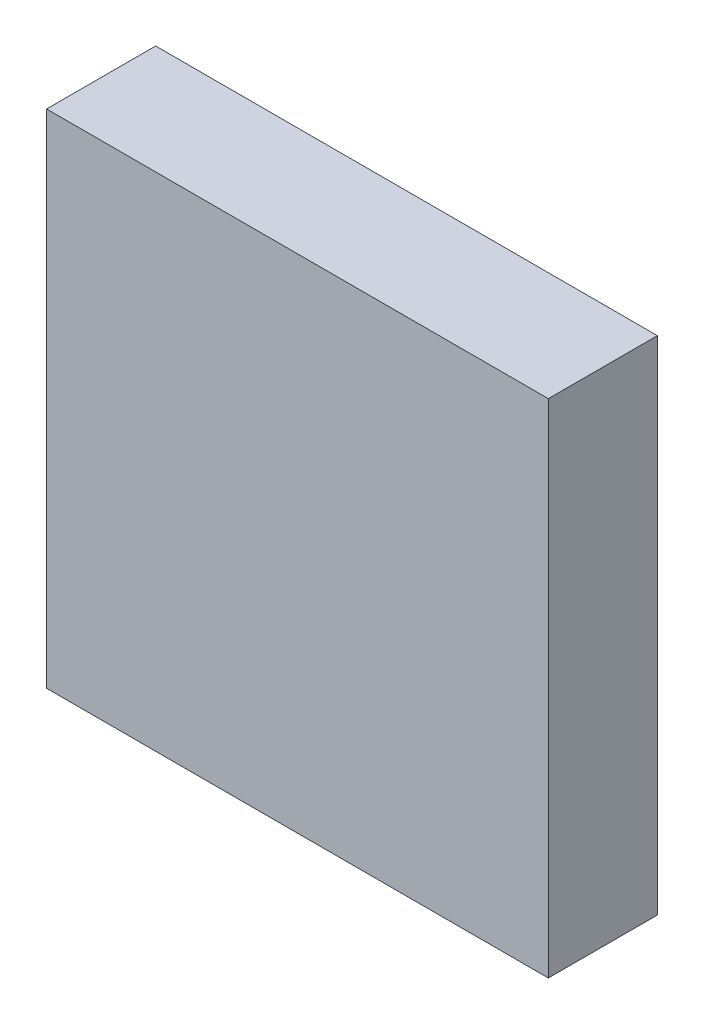
ISO-10303-21;
HEADER;
FILE_DESCRIPTION(('STEP AP214'),'2;1');
FILE_NAME('part.step','',(''),(''),'','','');
FILE_SCHEMA(('AUTOMOTIVE_DESIGN { 1 0 10303 214 1 1 1 1 }'));
ENDSEC;
DATA;
#1=APPLICATION_CONTEXT('core data for automotive mechanical design processes');
#2=APPLICATION_PROTOCOL_DEFINITION('international standard','automotive_design',2000,#1);
#3=PRODUCT_CONTEXT('',#1,'mechanical');
#4=PRODUCT('Part','Part','',(#3));
#5=PRODUCT_RELATED_PRODUCT_CATEGORY('part','',(#4));
#6=PRODUCT_DEFINITION_FORMATION('','',#4);
#7=PRODUCT_DEFINITION_CONTEXT('part definition',#1,'design');
#8=PRODUCT_DEFINITION('design','',#6,#7);
#9=PRODUCT_DEFINITION_SHAPE('','',#8);
#10=(LENGTH_UNIT() NAMED_UNIT(*) SI_UNIT(.MILLI.,.METRE.));
#11=(NAMED_UNIT(*) PLANE_ANGLE_UNIT() SI_UNIT($,.RADIAN.));
#12=(NAMED_UNIT(*) SI_UNIT($,.STERADIAN.) SOLID_ANGLE_UNIT());
#13=UNCERTAINTY_MEASURE_WITH_UNIT(LENGTH_MEASURE(1.E-05),#10,'distance_accuracy_value','');
#14=(GEOMETRIC_REPRESENTATION_CONTEXT(3) GLOBAL_UNCERTAINTY_ASSIGNED_CONTEXT((#13)) GLOBAL_UNIT_ASSIGNED_CONTEXT((#10,
#11,#12)) REPRESENTATION_CONTEXT('',''));
#15=CARTESIAN_POINT('',(0.,0.,0.));
#16=DIRECTION('',(0.,0.,1.));
#17=DIRECTION('',(1.,0.,0.));
#18=AXIS2_PLACEMENT_3D('',#15,#16,#17);
#19=CARTESIAN_POINT('',(0.,0.,5.));
#20=DIRECTION('',(1.,0.,0.));
#21=DIRECTION('',(0.,1.,0.));
#22=AXIS2_PLACEMENT_3D('',#19,#20,#21);
#23=PLANE('',#22);
#24=DIRECTION('',(0.,-1.,0.));
#25=VECTOR('',#24,1.);
#26=CARTESIAN_POINT('',(0.,0.,0.));
#27=LINE('',#26,#25);
#28=CARTESIAN_POINT('',(0.,0.,0.));
#29=VERTEX_POINT('',#28);
#30=CARTESIAN_POINT('',(0.,-23.,0.));
#31=VERTEX_POINT('',#30);
#32=EDGE_CURVE('E96',#29,#31,#27,.T.);
#33=ORIENTED_EDGE('',*,*,#32,.T.);
#34=DIRECTION('',(0.,0.,-1.));
#35=VECTOR('',#34,1.);
#36=CARTESIAN_POINT('',(0.,-23.,5.));
#37=LINE('',#36,#35);
#38=CARTESIAN_POINT('',(0.,-23.,5.));
#39=VERTEX_POINT('',#38);
#40=EDGE_CURVE('E11',#39,#31,#37,.T.);
#41=ORIENTED_EDGE('',*,*,#40,.F.);
#42=DIRECTION('',(0.,-1.,0.));
#43=VECTOR('',#42,1.);
#44=CARTESIAN_POINT('',(0.,0.,5.));
#45=LINE('',#44,#43);
#46=CARTESIAN_POINT('',(0.,0.,5.));
#47=VERTEX_POINT('',#46);
#48=EDGE_CURVE('E84',#47,#39,#45,.T.);
#49=ORIENTED_EDGE('',*,*,#48,.F.);
#50=DIRECTION('',(0.,0.,-1.));
#51=VECTOR('',#50,1.);
#52=CARTESIAN_POINT('',(0.,0.,5.));
#53=LINE('',#52,#51);
#54=EDGE_CURVE('E92',#47,#29,#53,.T.);
#55=ORIENTED_EDGE('',*,*,#54,.T.);
#56=EDGE_LOOP('',(#33,#41,#49,#55));
#57=FACE_BOUND('',#56,.T.);
#58=ADVANCED_FACE('F33',(#57),#23,.F.);
#59=CARTESIAN_POINT('',(0.,-23.,5.));
#60=DIRECTION('',(0.,1.,0.));
#61=DIRECTION('',(0.,0.,1.));
#62=AXIS2_PLACEMENT_3D('',#59,#60,#61);
#63=PLANE('',#62);
#64=DIRECTION('',(1.,0.,0.));
#65=VECTOR('',#64,1.);
#66=CARTESIAN_POINT('',(0.,-23.,0.));
#67=LINE('',#66,#65);
#68=CARTESIAN_POINT('',(23.,-23.,0.));
#69=VERTEX_POINT('',#68);
#70=EDGE_CURVE('E88',#31,#69,#67,.T.);
#71=ORIENTED_EDGE('',*,*,#70,.T.);
#72=DIRECTION('',(0.,0.,-1.));
#73=VECTOR('',#72,1.);
#74=CARTESIAN_POINT('',(23.,-23.,5.));
#75=LINE('',#74,#73);
#76=CARTESIAN_POINT('',(23.,-23.,5.));
#77=VERTEX_POINT('',#76);
#78=EDGE_CURVE('E41',#77,#69,#75,.T.);
#79=ORIENTED_EDGE('',*,*,#78,.F.);
#80=DIRECTION('',(1.,0.,0.));
#81=VECTOR('',#80,1.);
#82=CARTESIAN_POINT('',(0.,-23.,5.));
#83=LINE('',#82,#81);
#84=EDGE_CURVE('E79',#39,#77,#83,.T.);
#85=ORIENTED_EDGE('',*,*,#84,.F.);
#86=ORIENTED_EDGE('',*,*,#40,.T.);
#87=EDGE_LOOP('',(#71,#79,#85,#86));
#88=FACE_BOUND('',#87,.T.);
#89=ADVANCED_FACE('F87',(#88),#63,.F.);
#90=CARTESIAN_POINT('',(23.,0.,5.));
#91=DIRECTION('',(-1.,0.,0.));
#92=DIRECTION('',(0.,-1.,0.));
#93=AXIS2_PLACEMENT_3D('',#90,#91,#92);
#94=PLANE('',#93);
#95=DIRECTION('',(0.,1.,0.));
#96=VECTOR('',#95,1.);
#97=CARTESIAN_POINT('',(23.,0.,0.));
#98=LINE('',#97,#96);
#99=CARTESIAN_POINT('',(23.,0.,0.));
#100=VERTEX_POINT('',#99);
#101=EDGE_CURVE('E66',#69,#100,#98,.T.);
#102=ORIENTED_EDGE('',*,*,#101,.T.);
#103=DIRECTION('',(0.,0.,-1.));
#104=VECTOR('',#103,1.);
#105=CARTESIAN_POINT('',(23.,0.,5.));
#106=LINE('',#105,#104);
#107=CARTESIAN_POINT('',(23.,0.,5.));
#108=VERTEX_POINT('',#107);
#109=EDGE_CURVE('E89',#108,#100,#106,.T.);
#110=ORIENTED_EDGE('',*,*,#109,.F.);
#111=DIRECTION('',(0.,1.,0.));
#112=VECTOR('',#111,1.);
#113=CARTESIAN_POINT('',(23.,0.,5.));
#114=LINE('',#113,#112);
#115=EDGE_CURVE('E82',#77,#108,#114,.T.);
#116=ORIENTED_EDGE('',*,*,#115,.F.);
#117=ORIENTED_EDGE('',*,*,#78,.T.);
#118=EDGE_LOOP('',(#102,#110,#116,#117));
#119=FACE_BOUND('',#118,.T.);
#120=ADVANCED_FACE('F90',(#119),#94,.F.);
#121=CARTESIAN_POINT('',(0.,0.,5.));
#122=DIRECTION('',(0.,-1.,0.));
#123=DIRECTION('',(0.,0.,-1.));
#124=AXIS2_PLACEMENT_3D('',#121,#122,#123);
#125=PLANE('',#124);
#126=DIRECTION('',(-1.,0.,0.));
#127=VECTOR('',#126,1.);
#128=CARTESIAN_POINT('',(0.,0.,0.));
#129=LINE('',#128,#127);
#130=EDGE_CURVE('E72',#100,#29,#129,.T.);
#131=ORIENTED_EDGE('',*,*,#130,.T.);
#132=ORIENTED_EDGE('',*,*,#54,.F.);
#133=DIRECTION('',(-1.,0.,0.));
#134=VECTOR('',#133,1.);
#135=CARTESIAN_POINT('',(0.,0.,5.));
#136=LINE('',#135,#134);
#137=EDGE_CURVE('E49',#108,#47,#136,.T.);
#138=ORIENTED_EDGE('',*,*,#137,.F.);
#139=ORIENTED_EDGE('',*,*,#109,.T.);
#140=EDGE_LOOP('',(#131,#132,#138,#139));
#141=FACE_BOUND('',#140,.T.);
#142=ADVANCED_FACE('F103',(#141),#125,.F.);
#143=CARTESIAN_POINT('',(0.,0.,5.));
#144=DIRECTION('',(0.,0.,1.));
#145=DIRECTION('',(1.,0.,0.));
#146=AXIS2_PLACEMENT_3D('',#143,#144,#145);
#147=PLANE('',#146);
#148=ORIENTED_EDGE('',*,*,#48,.T.);
#149=ORIENTED_EDGE('',*,*,#84,.T.);
#150=ORIENTED_EDGE('',*,*,#115,.T.);
#151=ORIENTED_EDGE('',*,*,#137,.T.);
#152=EDGE_LOOP('',(#148,#149,#150,#151));
#153=FACE_BOUND('',#152,.T.);
#154=ADVANCED_FACE('F80',(#153),#147,.T.);
#155=CARTESIAN_POINT('',(0.,0.,0.));
#156=DIRECTION('',(0.,0.,1.));
#157=DIRECTION('',(1.,0.,0.));
#158=AXIS2_PLACEMENT_3D('',#155,#156,#157);
#159=PLANE('',#158);
#160=ORIENTED_EDGE('',*,*,#32,.F.);
#161=ORIENTED_EDGE('',*,*,#130,.F.);
#162=ORIENTED_EDGE('',*,*,#101,.F.);
#163=ORIENTED_EDGE('',*,*,#70,.F.);
#164=EDGE_LOOP('',(#160,#161,#162,#163));
#165=FACE_BOUND('',#164,.T.);
#166=ADVANCED_FACE('F106',(#165),#159,.F.);
#167=CLOSED_SHELL('',(#58,#89,#120,#142,#154,#166));
#168=MANIFOLD_SOLID_BREP('B2',#167);
#169=ADVANCED_BREP_SHAPE_REPRESENTATION('',(#18,#168),#14);
#170=SHAPE_DEFINITION_REPRESENTATION(#9,#169);
ENDSEC;
END-ISO-10303-21;
